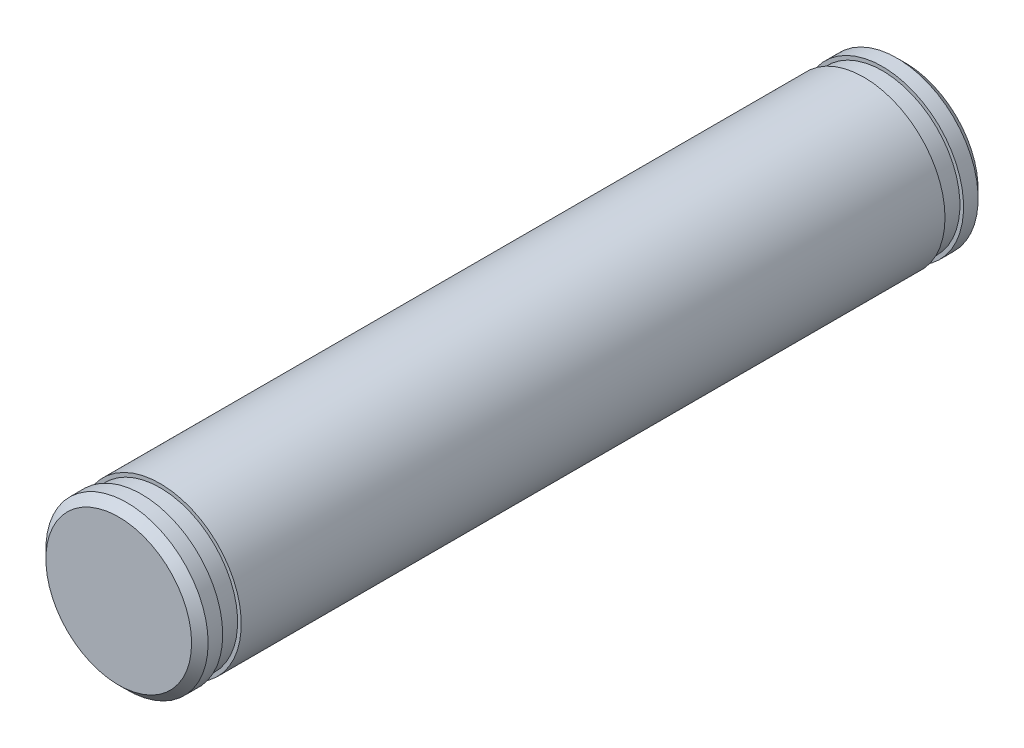
ISO-10303-21;
HEADER;
FILE_DESCRIPTION(('STEP AP214'),'2;1');
FILE_NAME('part.step','',(''),(''),'','','');
FILE_SCHEMA(('AUTOMOTIVE_DESIGN { 1 0 10303 214 1 1 1 1 }'));
ENDSEC;
DATA;
#1=APPLICATION_CONTEXT('core data for automotive mechanical design processes');
#2=APPLICATION_PROTOCOL_DEFINITION('international standard','automotive_design',2000,#1);
#3=PRODUCT_CONTEXT('',#1,'mechanical');
#4=PRODUCT('Part','Part','',(#3));
#5=PRODUCT_RELATED_PRODUCT_CATEGORY('part','',(#4));
#6=PRODUCT_DEFINITION_FORMATION('','',#4);
#7=PRODUCT_DEFINITION_CONTEXT('part definition',#1,'design');
#8=PRODUCT_DEFINITION('design','',#6,#7);
#9=PRODUCT_DEFINITION_SHAPE('','',#8);
#10=(LENGTH_UNIT() NAMED_UNIT(*) SI_UNIT(.MILLI.,.METRE.));
#11=(NAMED_UNIT(*) PLANE_ANGLE_UNIT() SI_UNIT($,.RADIAN.));
#12=(NAMED_UNIT(*) SI_UNIT($,.STERADIAN.) SOLID_ANGLE_UNIT());
#13=UNCERTAINTY_MEASURE_WITH_UNIT(LENGTH_MEASURE(1.E-05),#10,'distance_accuracy_value','');
#14=(GEOMETRIC_REPRESENTATION_CONTEXT(3) GLOBAL_UNCERTAINTY_ASSIGNED_CONTEXT((#13)) GLOBAL_UNIT_ASSIGNED_CONTEXT((#10,
#11,#12)) REPRESENTATION_CONTEXT('',''));
#15=CARTESIAN_POINT('',(0.,0.,0.));
#16=DIRECTION('',(0.,0.,1.));
#17=DIRECTION('',(1.,0.,0.));
#18=AXIS2_PLACEMENT_3D('',#15,#16,#17);
#19=CARTESIAN_POINT('',(0.,0.,0.));
#20=DIRECTION('',(0.,0.,1.));
#21=DIRECTION('',(1.,0.,0.));
#22=AXIS2_PLACEMENT_3D('',#19,#20,#21);
#23=PLANE('',#22);
#24=CARTESIAN_POINT('',(0.,0.,0.));
#25=DIRECTION('',(0.,0.,1.));
#26=DIRECTION('',(1.,0.,0.));
#27=AXIS2_PLACEMENT_3D('',#24,#25,#26);
#28=CIRCLE('',#27,5.588);
#29=CARTESIAN_POINT('',(5.588,0.,0.));
#30=VERTEX_POINT('',#29);
#31=EDGE_CURVE('E12',#30,#30,#28,.T.);
#32=ORIENTED_EDGE('',*,*,#31,.T.);
#33=EDGE_LOOP('',(#32));
#34=FACE_BOUND('',#33,.T.);
#35=ADVANCED_FACE('F52',(#34),#23,.T.);
#36=CARTESIAN_POINT('',(0.,0.,0.));
#37=DIRECTION('',(0.,0.,-1.));
#38=DIRECTION('',(-1.,0.,0.));
#39=AXIS2_PLACEMENT_3D('',#36,#37,#38);
#40=CYLINDRICAL_SURFACE('',#39,6.223);
#41=CARTESIAN_POINT('',(0.,0.,-0.635000000000003));
#42=DIRECTION('',(0.,0.,1.));
#43=DIRECTION('',(1.,0.,0.));
#44=AXIS2_PLACEMENT_3D('',#41,#42,#43);
#45=CIRCLE('',#44,6.223);
#46=CARTESIAN_POINT('',(6.223,0.,-0.635000000000003));
#47=VERTEX_POINT('',#46);
#48=EDGE_CURVE('E61',#47,#47,#45,.F.);
#49=ORIENTED_EDGE('',*,*,#48,.T.);
#50=EDGE_LOOP('',(#49));
#51=FACE_BOUND('',#50,.T.);
#52=CARTESIAN_POINT('',(0.,0.,-1.7526));
#53=DIRECTION('',(0.,0.,1.));
#54=DIRECTION('',(1.,0.,0.));
#55=AXIS2_PLACEMENT_3D('',#52,#53,#54);
#56=CIRCLE('',#55,6.223);
#57=CARTESIAN_POINT('',(6.223,0.,-1.7526));
#58=VERTEX_POINT('',#57);
#59=EDGE_CURVE('E83',#58,#58,#56,.F.);
#60=ORIENTED_EDGE('',*,*,#59,.F.);
#61=EDGE_LOOP('',(#60));
#62=FACE_BOUND('',#61,.T.);
#63=ADVANCED_FACE('F128',(#51,#62),#40,.T.);
#64=CARTESIAN_POINT('',(0.,5.9436,-3.175));
#65=DIRECTION('',(0.,0.,-1.));
#66=DIRECTION('',(-1.,0.,0.));
#67=AXIS2_PLACEMENT_3D('',#64,#65,#66);
#68=PLANE('',#67);
#69=CARTESIAN_POINT('',(0.,0.,-3.175));
#70=DIRECTION('',(0.,0.,-1.));
#71=DIRECTION('',(-1.,0.,0.));
#72=AXIS2_PLACEMENT_3D('',#69,#70,#71);
#73=CIRCLE('',#72,6.223);
#74=CARTESIAN_POINT('',(-6.223,0.,-3.175));
#75=VERTEX_POINT('',#74);
#76=EDGE_CURVE('E79',#75,#75,#73,.F.);
#77=ORIENTED_EDGE('',*,*,#76,.T.);
#78=EDGE_LOOP('',(#77));
#79=FACE_BOUND('',#78,.T.);
#80=CARTESIAN_POINT('',(0.,0.,-3.175));
#81=DIRECTION('',(0.,0.,-1.));
#82=DIRECTION('',(-1.,0.,0.));
#83=AXIS2_PLACEMENT_3D('',#80,#81,#82);
#84=CIRCLE('',#83,5.9436);
#85=CARTESIAN_POINT('',(-5.9436,0.,-3.175));
#86=VERTEX_POINT('',#85);
#87=EDGE_CURVE('E95',#86,#86,#84,.T.);
#88=ORIENTED_EDGE('',*,*,#87,.T.);
#89=EDGE_LOOP('',(#88));
#90=FACE_BOUND('',#89,.T.);
#91=ADVANCED_FACE('F129',(#79,#90),#68,.F.);
#92=CARTESIAN_POINT('',(0.,0.,0.));
#93=DIRECTION('',(0.,0.,-1.));
#94=DIRECTION('',(-1.,0.,0.));
#95=AXIS2_PLACEMENT_3D('',#92,#93,#94);
#96=CYLINDRICAL_SURFACE('',#95,5.9436);
#97=ORIENTED_EDGE('',*,*,#87,.F.);
#98=EDGE_LOOP('',(#97));
#99=FACE_BOUND('',#98,.T.);
#100=CARTESIAN_POINT('',(0.,0.,-1.7526));
#101=DIRECTION('',(0.,0.,-1.));
#102=DIRECTION('',(-1.,0.,0.));
#103=AXIS2_PLACEMENT_3D('',#100,#101,#102);
#104=CIRCLE('',#103,5.9436);
#105=CARTESIAN_POINT('',(-5.9436,0.,-1.7526));
#106=VERTEX_POINT('',#105);
#107=EDGE_CURVE('E100',#106,#106,#104,.T.);
#108=ORIENTED_EDGE('',*,*,#107,.T.);
#109=EDGE_LOOP('',(#108));
#110=FACE_BOUND('',#109,.T.);
#111=ADVANCED_FACE('F113',(#99,#110),#96,.T.);
#112=CARTESIAN_POINT('',(0.,5.9436,-1.7526));
#113=DIRECTION('',(0.,0.,1.));
#114=DIRECTION('',(1.,0.,0.));
#115=AXIS2_PLACEMENT_3D('',#112,#113,#114);
#116=PLANE('',#115);
#117=ORIENTED_EDGE('',*,*,#59,.T.);
#118=EDGE_LOOP('',(#117));
#119=FACE_BOUND('',#118,.T.);
#120=ORIENTED_EDGE('',*,*,#107,.F.);
#121=EDGE_LOOP('',(#120));
#122=FACE_BOUND('',#121,.T.);
#123=ADVANCED_FACE('F115',(#119,#122),#116,.F.);
#124=ORIENTED_EDGE('',*,*,#76,.F.);
#125=EDGE_LOOP('',(#124));
#126=FACE_BOUND('',#125,.T.);
#127=CARTESIAN_POINT('',(0.,0.,-57.15));
#128=DIRECTION('',(0.,0.,1.));
#129=DIRECTION('',(1.,0.,0.));
#130=AXIS2_PLACEMENT_3D('',#127,#128,#129);
#131=CIRCLE('',#130,6.223);
#132=CARTESIAN_POINT('',(6.223,0.,-57.15));
#133=VERTEX_POINT('',#132);
#134=EDGE_CURVE('E91',#133,#133,#131,.F.);
#135=ORIENTED_EDGE('',*,*,#134,.F.);
#136=EDGE_LOOP('',(#135));
#137=FACE_BOUND('',#136,.T.);
#138=ADVANCED_FACE('F117',(#126,#137),#40,.T.);
#139=CARTESIAN_POINT('',(0.,5.9436,-58.5724));
#140=DIRECTION('',(0.,0.,-1.));
#141=DIRECTION('',(-1.,0.,0.));
#142=AXIS2_PLACEMENT_3D('',#139,#140,#141);
#143=PLANE('',#142);
#144=CARTESIAN_POINT('',(0.,0.,-58.5724));
#145=DIRECTION('',(0.,0.,-1.));
#146=DIRECTION('',(-1.,0.,0.));
#147=AXIS2_PLACEMENT_3D('',#144,#145,#146);
#148=CIRCLE('',#147,6.223);
#149=CARTESIAN_POINT('',(-6.223,0.,-58.5724));
#150=VERTEX_POINT('',#149);
#151=EDGE_CURVE('E87',#150,#150,#148,.F.);
#152=ORIENTED_EDGE('',*,*,#151,.T.);
#153=EDGE_LOOP('',(#152));
#154=FACE_BOUND('',#153,.T.);
#155=CARTESIAN_POINT('',(0.,0.,-58.5724));
#156=DIRECTION('',(0.,0.,-1.));
#157=DIRECTION('',(-1.,0.,0.));
#158=AXIS2_PLACEMENT_3D('',#155,#156,#157);
#159=CIRCLE('',#158,5.9436);
#160=CARTESIAN_POINT('',(-5.9436,0.,-58.5724));
#161=VERTEX_POINT('',#160);
#162=EDGE_CURVE('E96',#161,#161,#159,.T.);
#163=ORIENTED_EDGE('',*,*,#162,.T.);
#164=EDGE_LOOP('',(#163));
#165=FACE_BOUND('',#164,.T.);
#166=ADVANCED_FACE('F124',(#154,#165),#143,.F.);
#167=CARTESIAN_POINT('',(0.,0.,0.));
#168=DIRECTION('',(0.,0.,-1.));
#169=DIRECTION('',(-1.,0.,0.));
#170=AXIS2_PLACEMENT_3D('',#167,#168,#169);
#171=CYLINDRICAL_SURFACE('',#170,5.9436);
#172=ORIENTED_EDGE('',*,*,#162,.F.);
#173=EDGE_LOOP('',(#172));
#174=FACE_BOUND('',#173,.T.);
#175=CARTESIAN_POINT('',(0.,0.,-57.15));
#176=DIRECTION('',(0.,0.,-1.));
#177=DIRECTION('',(-1.,0.,0.));
#178=AXIS2_PLACEMENT_3D('',#175,#176,#177);
#179=CIRCLE('',#178,5.9436);
#180=CARTESIAN_POINT('',(-5.9436,0.,-57.15));
#181=VERTEX_POINT('',#180);
#182=EDGE_CURVE('E101',#181,#181,#179,.T.);
#183=ORIENTED_EDGE('',*,*,#182,.T.);
#184=EDGE_LOOP('',(#183));
#185=FACE_BOUND('',#184,.T.);
#186=ADVANCED_FACE('F160',(#174,#185),#171,.T.);
#187=CARTESIAN_POINT('',(0.,5.9436,-57.15));
#188=DIRECTION('',(0.,0.,1.));
#189=DIRECTION('',(1.,0.,0.));
#190=AXIS2_PLACEMENT_3D('',#187,#188,#189);
#191=PLANE('',#190);
#192=ORIENTED_EDGE('',*,*,#134,.T.);
#193=EDGE_LOOP('',(#192));
#194=FACE_BOUND('',#193,.T.);
#195=ORIENTED_EDGE('',*,*,#182,.F.);
#196=EDGE_LOOP('',(#195));
#197=FACE_BOUND('',#196,.T.);
#198=ADVANCED_FACE('F156',(#194,#197),#191,.F.);
#199=CARTESIAN_POINT('',(0.,0.,-60.325));
#200=DIRECTION('',(0.,0.,-1.));
#201=DIRECTION('',(-1.,0.,0.));
#202=AXIS2_PLACEMENT_3D('',#199,#200,#201);
#203=PLANE('',#202);
#204=CARTESIAN_POINT('',(0.,0.,-60.325));
#205=DIRECTION('',(0.,0.,-1.));
#206=DIRECTION('',(-1.,0.,0.));
#207=AXIS2_PLACEMENT_3D('',#204,#205,#206);
#208=CIRCLE('',#207,5.588);
#209=CARTESIAN_POINT('',(-5.588,0.,-60.325));
#210=VERTEX_POINT('',#209);
#211=EDGE_CURVE('E73',#210,#210,#208,.T.);
#212=ORIENTED_EDGE('',*,*,#211,.T.);
#213=EDGE_LOOP('',(#212));
#214=FACE_BOUND('',#213,.T.);
#215=ADVANCED_FACE('F149',(#214),#203,.T.);
#216=CARTESIAN_POINT('',(0.,0.,-59.69));
#217=DIRECTION('',(0.,0.,-1.));
#218=DIRECTION('',(-1.,0.,0.));
#219=AXIS2_PLACEMENT_3D('',#216,#217,#218);
#220=CIRCLE('',#219,6.223);
#221=CARTESIAN_POINT('',(-6.223,0.,-59.69));
#222=VERTEX_POINT('',#221);
#223=EDGE_CURVE('E67',#222,#222,#220,.F.);
#224=ORIENTED_EDGE('',*,*,#223,.T.);
#225=EDGE_LOOP('',(#224));
#226=FACE_BOUND('',#225,.T.);
#227=ORIENTED_EDGE('',*,*,#151,.F.);
#228=EDGE_LOOP('',(#227));
#229=FACE_BOUND('',#228,.T.);
#230=ADVANCED_FACE('F127',(#226,#229),#40,.T.);
#231=CARTESIAN_POINT('',(0.,0.,-60.325));
#232=DIRECTION('',(0.,0.,1.));
#233=DIRECTION('',(1.,0.,0.));
#234=AXIS2_PLACEMENT_3D('',#231,#232,#233);
#235=CONICAL_SURFACE('',#234,5.588,0.785398163397454);
#236=ORIENTED_EDGE('',*,*,#223,.F.);
#237=EDGE_LOOP('',(#236));
#238=FACE_BOUND('',#237,.T.);
#239=ORIENTED_EDGE('',*,*,#211,.F.);
#240=EDGE_LOOP('',(#239));
#241=FACE_BOUND('',#240,.T.);
#242=ADVANCED_FACE('F139',(#238,#241),#235,.T.);
#243=CARTESIAN_POINT('',(0.,0.,-0.635000000000003));
#244=DIRECTION('',(0.,0.,-1.));
#245=DIRECTION('',(-1.,0.,0.));
#246=AXIS2_PLACEMENT_3D('',#243,#244,#245);
#247=CONICAL_SURFACE('',#246,6.223,0.785398163397443);
#248=ORIENTED_EDGE('',*,*,#31,.F.);
#249=EDGE_LOOP('',(#248));
#250=FACE_BOUND('',#249,.T.);
#251=ORIENTED_EDGE('',*,*,#48,.F.);
#252=EDGE_LOOP('',(#251));
#253=FACE_BOUND('',#252,.T.);
#254=ADVANCED_FACE('F55',(#250,#253),#247,.T.);
#255=CLOSED_SHELL('',(#35,#63,#91,#111,#123,#138,#166,#186,#198,#215,#230,#242,#254));
#256=MANIFOLD_SOLID_BREP('B2',#255);
#257=ADVANCED_BREP_SHAPE_REPRESENTATION('',(#18,#256),#14);
#258=SHAPE_DEFINITION_REPRESENTATION(#9,#257);
ENDSEC;
END-ISO-10303-21;
